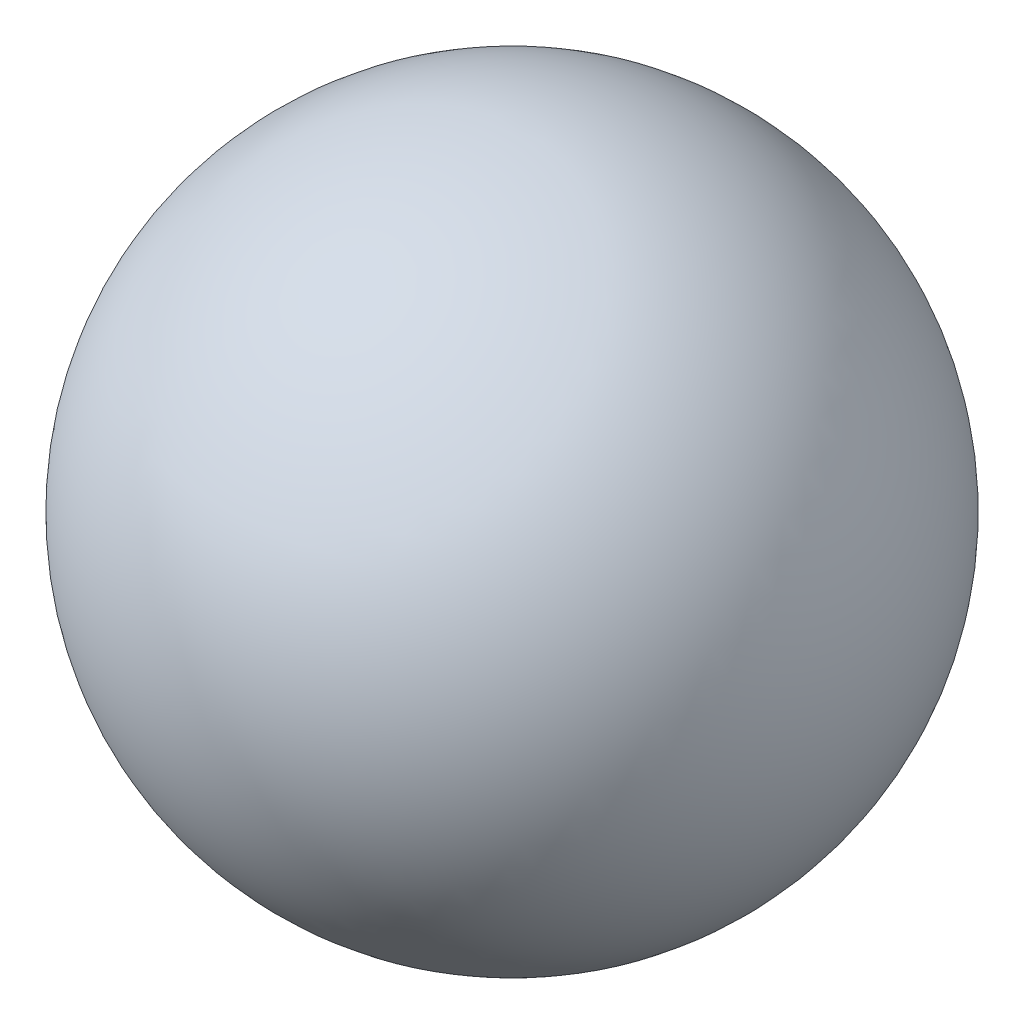
ISO-10303-21;
HEADER;
FILE_DESCRIPTION(('STEP AP214'),'2;1');
FILE_NAME('part.step','',(''),(''),'','','');
FILE_SCHEMA(('AUTOMOTIVE_DESIGN { 1 0 10303 214 1 1 1 1 }'));
ENDSEC;
DATA;
#1=APPLICATION_CONTEXT('core data for automotive mechanical design processes');
#2=APPLICATION_PROTOCOL_DEFINITION('international standard','automotive_design',2000,#1);
#3=PRODUCT_CONTEXT('',#1,'mechanical');
#4=PRODUCT('Part','Part','',(#3));
#5=PRODUCT_RELATED_PRODUCT_CATEGORY('part','',(#4));
#6=PRODUCT_DEFINITION_FORMATION('','',#4);
#7=PRODUCT_DEFINITION_CONTEXT('part definition',#1,'design');
#8=PRODUCT_DEFINITION('design','',#6,#7);
#9=PRODUCT_DEFINITION_SHAPE('','',#8);
#10=(LENGTH_UNIT() NAMED_UNIT(*) SI_UNIT(.MILLI.,.METRE.));
#11=(NAMED_UNIT(*) PLANE_ANGLE_UNIT() SI_UNIT($,.RADIAN.));
#12=(NAMED_UNIT(*) SI_UNIT($,.STERADIAN.) SOLID_ANGLE_UNIT());
#13=UNCERTAINTY_MEASURE_WITH_UNIT(LENGTH_MEASURE(1.E-05),#10,'distance_accuracy_value','');
#14=(GEOMETRIC_REPRESENTATION_CONTEXT(3) GLOBAL_UNCERTAINTY_ASSIGNED_CONTEXT((#13)) GLOBAL_UNIT_ASSIGNED_CONTEXT((#10,
#11,#12)) REPRESENTATION_CONTEXT('',''));
#15=CARTESIAN_POINT('',(0.,0.,0.));
#16=DIRECTION('',(0.,0.,1.));
#17=DIRECTION('',(1.,0.,0.));
#18=AXIS2_PLACEMENT_3D('',#15,#16,#17);
#19=CARTESIAN_POINT('',(0.,0.,0.));
#20=DIRECTION('',(0.,1.,0.));
#21=DIRECTION('',(1.,0.,0.));
#22=AXIS2_PLACEMENT_3D('',#19,#20,#21);
#23=SPHERICAL_SURFACE('',#22,6.4);
#24=CARTESIAN_POINT('',(0.,6.4,0.));
#25=VERTEX_POINT('',#24);
#26=VERTEX_LOOP('',#25);
#27=FACE_BOUND('',#26,.T.);
#28=ADVANCED_FACE('F32',(#27),#23,.T.);
#29=CLOSED_SHELL('',(#28));
#30=MANIFOLD_SOLID_BREP('B2',#29);
#31=ADVANCED_BREP_SHAPE_REPRESENTATION('',(#18,#30),#14);
#32=SHAPE_DEFINITION_REPRESENTATION(#9,#31);
ENDSEC;
END-ISO-10303-21;
